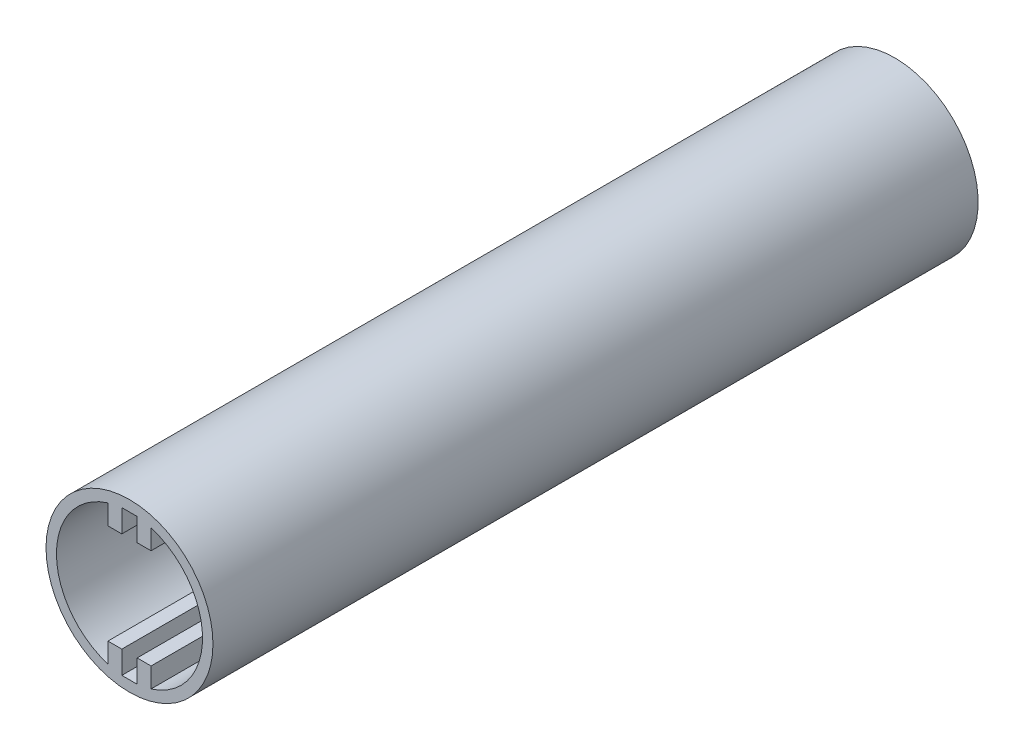
ISO-10303-21;
HEADER;
FILE_DESCRIPTION(('STEP AP214'),'2;1');
FILE_NAME('part.step','',(''),(''),'','','');
FILE_SCHEMA(('AUTOMOTIVE_DESIGN { 1 0 10303 214 1 1 1 1 }'));
ENDSEC;
DATA;
#1=APPLICATION_CONTEXT('core data for automotive mechanical design processes');
#2=APPLICATION_PROTOCOL_DEFINITION('international standard','automotive_design',2000,#1);
#3=PRODUCT_CONTEXT('',#1,'mechanical');
#4=PRODUCT('Part','Part','',(#3));
#5=PRODUCT_RELATED_PRODUCT_CATEGORY('part','',(#4));
#6=PRODUCT_DEFINITION_FORMATION('','',#4);
#7=PRODUCT_DEFINITION_CONTEXT('part definition',#1,'design');
#8=PRODUCT_DEFINITION('design','',#6,#7);
#9=PRODUCT_DEFINITION_SHAPE('','',#8);
#10=(LENGTH_UNIT() NAMED_UNIT(*) SI_UNIT(.MILLI.,.METRE.));
#11=(NAMED_UNIT(*) PLANE_ANGLE_UNIT() SI_UNIT($,.RADIAN.));
#12=(NAMED_UNIT(*) SI_UNIT($,.STERADIAN.) SOLID_ANGLE_UNIT());
#13=UNCERTAINTY_MEASURE_WITH_UNIT(LENGTH_MEASURE(1.E-05),#10,'distance_accuracy_value','');
#14=(GEOMETRIC_REPRESENTATION_CONTEXT(3) GLOBAL_UNCERTAINTY_ASSIGNED_CONTEXT((#13)) GLOBAL_UNIT_ASSIGNED_CONTEXT((#10,
#11,#12)) REPRESENTATION_CONTEXT('',''));
#15=CARTESIAN_POINT('',(0.,0.,0.));
#16=DIRECTION('',(0.,0.,1.));
#17=DIRECTION('',(1.,0.,0.));
#18=AXIS2_PLACEMENT_3D('',#15,#16,#17);
#19=CARTESIAN_POINT('',(0.,0.,-17.5));
#20=DIRECTION('',(0.,0.,1.));
#21=DIRECTION('',(1.,0.,0.));
#22=AXIS2_PLACEMENT_3D('',#19,#20,#21);
#23=PLANE('',#22);
#24=DIRECTION('',(0.,1.,0.));
#25=VECTOR('',#24,1.);
#26=CARTESIAN_POINT('',(-1.55,5.01597448159378,-17.5));
#27=LINE('',#26,#25);
#28=CARTESIAN_POINT('',(-1.55,3.58519596248818,-17.5));
#29=VERTEX_POINT('',#28);
#30=CARTESIAN_POINT('',(-1.55,5.01597448159378,-17.5));
#31=VERTEX_POINT('',#30);
#32=EDGE_CURVE('E168',#29,#31,#27,.T.);
#33=ORIENTED_EDGE('',*,*,#32,.T.);
#34=CARTESIAN_POINT('',(0.,0.,-17.5));
#35=DIRECTION('',(0.,0.,-1.));
#36=DIRECTION('',(-1.,0.,0.));
#37=AXIS2_PLACEMENT_3D('',#34,#35,#36);
#38=CIRCLE('',#37,5.25);
#39=CARTESIAN_POINT('',(-0.55,5.22111099288264,-17.5));
#40=VERTEX_POINT('',#39);
#41=EDGE_CURVE('E51',#31,#40,#38,.T.);
#42=ORIENTED_EDGE('',*,*,#41,.T.);
#43=DIRECTION('',(0.,-1.,0.));
#44=VECTOR('',#43,1.);
#45=CARTESIAN_POINT('',(-0.55,3.58519596248818,-17.5));
#46=LINE('',#45,#44);
#47=CARTESIAN_POINT('',(-0.55,3.58519596248818,-17.5));
#48=VERTEX_POINT('',#47);
#49=EDGE_CURVE('E212',#40,#48,#46,.T.);
#50=ORIENTED_EDGE('',*,*,#49,.T.);
#51=DIRECTION('',(-1.,0.,0.));
#52=VECTOR('',#51,1.);
#53=CARTESIAN_POINT('',(-1.55,3.58519596248818,-17.5));
#54=LINE('',#53,#52);
#55=EDGE_CURVE('E266',#48,#29,#54,.T.);
#56=ORIENTED_EDGE('',*,*,#55,.T.);
#57=EDGE_LOOP('',(#33,#42,#50,#56));
#58=FACE_BOUND('',#57,.T.);
#59=ADVANCED_FACE('F39',(#58),#23,.F.);
#60=DIRECTION('',(-1.,0.,0.));
#61=VECTOR('',#60,1.);
#62=CARTESIAN_POINT('',(-0.55,5.22111099288264,-17.5));
#63=LINE('',#62,#61);
#64=CARTESIAN_POINT('',(0.55,5.22111099288264,-17.5));
#65=VERTEX_POINT('',#64);
#66=EDGE_CURVE('E208',#65,#40,#63,.T.);
#67=ORIENTED_EDGE('',*,*,#66,.T.);
#68=EDGE_CURVE('E11',#40,#65,#38,.T.);
#69=ORIENTED_EDGE('',*,*,#68,.T.);
#70=EDGE_LOOP('',(#67,#69));
#71=FACE_BOUND('',#70,.T.);
#72=ADVANCED_FACE('F353',(#71),#23,.F.);
#73=DIRECTION('',(0.,1.,0.));
#74=VECTOR('',#73,1.);
#75=CARTESIAN_POINT('',(0.55,3.58519596248818,-17.5));
#76=LINE('',#75,#74);
#77=CARTESIAN_POINT('',(0.55,3.58519596248818,-17.5));
#78=VERTEX_POINT('',#77);
#79=EDGE_CURVE('E219',#78,#65,#76,.T.);
#80=ORIENTED_EDGE('',*,*,#79,.T.);
#81=CARTESIAN_POINT('',(1.55,5.01597448159378,-17.5));
#82=VERTEX_POINT('',#81);
#83=EDGE_CURVE('E49',#65,#82,#38,.T.);
#84=ORIENTED_EDGE('',*,*,#83,.T.);
#85=DIRECTION('',(0.,-1.,0.));
#86=VECTOR('',#85,1.);
#87=CARTESIAN_POINT('',(1.55,5.01597448159378,-17.5));
#88=LINE('',#87,#86);
#89=CARTESIAN_POINT('',(1.55,3.58519596248818,-17.5));
#90=VERTEX_POINT('',#89);
#91=EDGE_CURVE('E292',#82,#90,#88,.T.);
#92=ORIENTED_EDGE('',*,*,#91,.T.);
#93=DIRECTION('',(-1.,0.,0.));
#94=VECTOR('',#93,1.);
#95=CARTESIAN_POINT('',(1.55,3.58519596248818,-17.5));
#96=LINE('',#95,#94);
#97=EDGE_CURVE('E296',#90,#78,#96,.T.);
#98=ORIENTED_EDGE('',*,*,#97,.T.);
#99=EDGE_LOOP('',(#80,#84,#92,#98));
#100=FACE_BOUND('',#99,.T.);
#101=ADVANCED_FACE('F403',(#100),#23,.F.);
#102=DIRECTION('',(0.,-1.,0.));
#103=VECTOR('',#102,1.);
#104=CARTESIAN_POINT('',(1.55,-5.01597448159378,-17.5));
#105=LINE('',#104,#103);
#106=CARTESIAN_POINT('',(1.55,-3.58519596248818,-17.5));
#107=VERTEX_POINT('',#106);
#108=CARTESIAN_POINT('',(1.55,-5.01597448159378,-17.5));
#109=VERTEX_POINT('',#108);
#110=EDGE_CURVE('E288',#107,#109,#105,.T.);
#111=ORIENTED_EDGE('',*,*,#110,.T.);
#112=CARTESIAN_POINT('',(0.55,-5.22111099288264,-17.5));
#113=VERTEX_POINT('',#112);
#114=EDGE_CURVE('E190',#109,#113,#38,.T.);
#115=ORIENTED_EDGE('',*,*,#114,.T.);
#116=DIRECTION('',(0.,1.,0.));
#117=VECTOR('',#116,1.);
#118=CARTESIAN_POINT('',(0.55,-3.58519596248818,-17.5));
#119=LINE('',#118,#117);
#120=CARTESIAN_POINT('',(0.55,-3.58519596248818,-17.5));
#121=VERTEX_POINT('',#120);
#122=EDGE_CURVE('E280',#113,#121,#119,.T.);
#123=ORIENTED_EDGE('',*,*,#122,.T.);
#124=DIRECTION('',(1.,0.,0.));
#125=VECTOR('',#124,1.);
#126=CARTESIAN_POINT('',(1.55,-3.58519596248818,-17.5));
#127=LINE('',#126,#125);
#128=EDGE_CURVE('E284',#121,#107,#127,.T.);
#129=ORIENTED_EDGE('',*,*,#128,.T.);
#130=EDGE_LOOP('',(#111,#115,#123,#129));
#131=FACE_BOUND('',#130,.T.);
#132=ADVANCED_FACE('F362',(#131),#23,.F.);
#133=DIRECTION('',(1.,0.,0.));
#134=VECTOR('',#133,1.);
#135=CARTESIAN_POINT('',(-0.55,-5.22111099288264,-17.5));
#136=LINE('',#135,#134);
#137=CARTESIAN_POINT('',(-0.55,-5.22111099288264,-17.5));
#138=VERTEX_POINT('',#137);
#139=EDGE_CURVE('E276',#138,#113,#136,.T.);
#140=ORIENTED_EDGE('',*,*,#139,.T.);
#141=EDGE_CURVE('E187',#113,#138,#38,.T.);
#142=ORIENTED_EDGE('',*,*,#141,.T.);
#143=EDGE_LOOP('',(#140,#142));
#144=FACE_BOUND('',#143,.T.);
#145=ADVANCED_FACE('F378',(#144),#23,.F.);
#146=CARTESIAN_POINT('',(0.,0.,17.5));
#147=DIRECTION('',(0.,0.,1.));
#148=DIRECTION('',(1.,0.,0.));
#149=AXIS2_PLACEMENT_3D('',#146,#147,#148);
#150=PLANE('',#149);
#151=CARTESIAN_POINT('',(0.,0.,17.5));
#152=DIRECTION('',(0.,0.,1.));
#153=DIRECTION('',(1.,0.,0.));
#154=AXIS2_PLACEMENT_3D('',#151,#152,#153);
#155=CIRCLE('',#154,6.);
#156=CARTESIAN_POINT('',(6.,0.,17.5));
#157=VERTEX_POINT('',#156);
#158=EDGE_CURVE('E43',#157,#157,#155,.T.);
#159=ORIENTED_EDGE('',*,*,#158,.T.);
#160=EDGE_LOOP('',(#159));
#161=FACE_BOUND('',#160,.T.);
#162=DIRECTION('',(0.,-1.,0.));
#163=VECTOR('',#162,1.);
#164=CARTESIAN_POINT('',(-0.55,3.58519596248818,17.5));
#165=LINE('',#164,#163);
#166=CARTESIAN_POINT('',(-0.55,5.22111099288264,17.5));
#167=VERTEX_POINT('',#166);
#168=CARTESIAN_POINT('',(-0.55,3.58519596248818,17.5));
#169=VERTEX_POINT('',#168);
#170=EDGE_CURVE('E218',#167,#169,#165,.T.);
#171=ORIENTED_EDGE('',*,*,#170,.F.);
#172=DIRECTION('',(-1.,0.,0.));
#173=VECTOR('',#172,1.);
#174=CARTESIAN_POINT('',(-0.55,5.22111099288264,17.5));
#175=LINE('',#174,#173);
#176=CARTESIAN_POINT('',(0.55,5.22111099288264,17.5));
#177=VERTEX_POINT('',#176);
#178=EDGE_CURVE('E215',#177,#167,#175,.T.);
#179=ORIENTED_EDGE('',*,*,#178,.F.);
#180=DIRECTION('',(0.,1.,0.));
#181=VECTOR('',#180,1.);
#182=CARTESIAN_POINT('',(0.55,3.58519596248818,17.5));
#183=LINE('',#182,#181);
#184=CARTESIAN_POINT('',(0.55,3.58519596248818,17.5));
#185=VERTEX_POINT('',#184);
#186=EDGE_CURVE('E260',#185,#177,#183,.T.);
#187=ORIENTED_EDGE('',*,*,#186,.F.);
#188=DIRECTION('',(-1.,0.,0.));
#189=VECTOR('',#188,1.);
#190=CARTESIAN_POINT('',(1.55,3.58519596248818,17.5));
#191=LINE('',#190,#189);
#192=CARTESIAN_POINT('',(1.55,3.58519596248818,17.5));
#193=VERTEX_POINT('',#192);
#194=EDGE_CURVE('E257',#193,#185,#191,.T.);
#195=ORIENTED_EDGE('',*,*,#194,.F.);
#196=DIRECTION('',(0.,-1.,0.));
#197=VECTOR('',#196,1.);
#198=CARTESIAN_POINT('',(1.55,5.01597448159378,17.5));
#199=LINE('',#198,#197);
#200=CARTESIAN_POINT('',(1.55,5.01597448159378,17.5));
#201=VERTEX_POINT('',#200);
#202=EDGE_CURVE('E254',#201,#193,#199,.T.);
#203=ORIENTED_EDGE('',*,*,#202,.F.);
#204=CARTESIAN_POINT('',(0.,0.,17.5));
#205=DIRECTION('',(0.,0.,1.));
#206=DIRECTION('',(1.,0.,0.));
#207=AXIS2_PLACEMENT_3D('',#204,#205,#206);
#208=CIRCLE('',#207,5.25);
#209=CARTESIAN_POINT('',(1.55,-5.01597448159378,17.5));
#210=VERTEX_POINT('',#209);
#211=EDGE_CURVE('E251',#210,#201,#208,.T.);
#212=ORIENTED_EDGE('',*,*,#211,.F.);
#213=DIRECTION('',(0.,-1.,0.));
#214=VECTOR('',#213,1.);
#215=CARTESIAN_POINT('',(1.55,-5.01597448159378,17.5));
#216=LINE('',#215,#214);
#217=CARTESIAN_POINT('',(1.55,-3.58519596248818,17.5));
#218=VERTEX_POINT('',#217);
#219=EDGE_CURVE('E248',#218,#210,#216,.T.);
#220=ORIENTED_EDGE('',*,*,#219,.F.);
#221=DIRECTION('',(1.,0.,0.));
#222=VECTOR('',#221,1.);
#223=CARTESIAN_POINT('',(1.55,-3.58519596248818,17.5));
#224=LINE('',#223,#222);
#225=CARTESIAN_POINT('',(0.55,-3.58519596248818,17.5));
#226=VERTEX_POINT('',#225);
#227=EDGE_CURVE('E245',#226,#218,#224,.T.);
#228=ORIENTED_EDGE('',*,*,#227,.F.);
#229=DIRECTION('',(0.,1.,0.));
#230=VECTOR('',#229,1.);
#231=CARTESIAN_POINT('',(0.55,-3.58519596248818,17.5));
#232=LINE('',#231,#230);
#233=CARTESIAN_POINT('',(0.55,-5.22111099288264,17.5));
#234=VERTEX_POINT('',#233);
#235=EDGE_CURVE('E242',#234,#226,#232,.T.);
#236=ORIENTED_EDGE('',*,*,#235,.F.);
#237=DIRECTION('',(1.,0.,0.));
#238=VECTOR('',#237,1.);
#239=CARTESIAN_POINT('',(-0.55,-5.22111099288264,17.5));
#240=LINE('',#239,#238);
#241=CARTESIAN_POINT('',(-0.55,-5.22111099288264,17.5));
#242=VERTEX_POINT('',#241);
#243=EDGE_CURVE('E239',#242,#234,#240,.T.);
#244=ORIENTED_EDGE('',*,*,#243,.F.);
#245=DIRECTION('',(0.,-1.,0.));
#246=VECTOR('',#245,1.);
#247=CARTESIAN_POINT('',(-0.55,-3.58519596248818,17.5));
#248=LINE('',#247,#246);
#249=CARTESIAN_POINT('',(-0.55,-3.58519596248818,17.5));
#250=VERTEX_POINT('',#249);
#251=EDGE_CURVE('E236',#250,#242,#248,.T.);
#252=ORIENTED_EDGE('',*,*,#251,.F.);
#253=DIRECTION('',(1.,0.,0.));
#254=VECTOR('',#253,1.);
#255=CARTESIAN_POINT('',(-1.55,-3.58519596248818,17.5));
#256=LINE('',#255,#254);
#257=CARTESIAN_POINT('',(-1.55,-3.58519596248818,17.5));
#258=VERTEX_POINT('',#257);
#259=EDGE_CURVE('E233',#258,#250,#256,.T.);
#260=ORIENTED_EDGE('',*,*,#259,.F.);
#261=DIRECTION('',(0.,1.,0.));
#262=VECTOR('',#261,1.);
#263=CARTESIAN_POINT('',(-1.55,-5.01597448159378,17.5));
#264=LINE('',#263,#262);
#265=CARTESIAN_POINT('',(-1.55,-5.01597448159378,17.5));
#266=VERTEX_POINT('',#265);
#267=EDGE_CURVE('E230',#266,#258,#264,.T.);
#268=ORIENTED_EDGE('',*,*,#267,.F.);
#269=CARTESIAN_POINT('',(0.,0.,17.5));
#270=DIRECTION('',(0.,0.,1.));
#271=DIRECTION('',(1.,0.,0.));
#272=AXIS2_PLACEMENT_3D('',#269,#270,#271);
#273=CIRCLE('',#272,5.25);
#274=CARTESIAN_POINT('',(-1.55,5.01597448159378,17.5));
#275=VERTEX_POINT('',#274);
#276=EDGE_CURVE('E178',#275,#266,#273,.T.);
#277=ORIENTED_EDGE('',*,*,#276,.F.);
#278=DIRECTION('',(0.,1.,0.));
#279=VECTOR('',#278,1.);
#280=CARTESIAN_POINT('',(-1.55,5.01597448159378,17.5));
#281=LINE('',#280,#279);
#282=CARTESIAN_POINT('',(-1.55,3.58519596248818,17.5));
#283=VERTEX_POINT('',#282);
#284=EDGE_CURVE('E225',#283,#275,#281,.T.);
#285=ORIENTED_EDGE('',*,*,#284,.F.);
#286=DIRECTION('',(-1.,0.,0.));
#287=VECTOR('',#286,1.);
#288=CARTESIAN_POINT('',(-1.55,3.58519596248818,17.5));
#289=LINE('',#288,#287);
#290=EDGE_CURVE('E222',#169,#283,#289,.T.);
#291=ORIENTED_EDGE('',*,*,#290,.F.);
#292=EDGE_LOOP('',(#171,#179,#187,#195,#203,#212,#220,#228,#236,#244,#252,#260,#268,#277,#285,#291));
#293=FACE_BOUND('',#292,.T.);
#294=ADVANCED_FACE('F384',(#161,#293),#150,.T.);
#295=DIRECTION('',(0.,-1.,0.));
#296=VECTOR('',#295,1.);
#297=CARTESIAN_POINT('',(-0.55,-3.58519596248818,-17.5));
#298=LINE('',#297,#296);
#299=CARTESIAN_POINT('',(-0.55,-3.58519596248818,-17.5));
#300=VERTEX_POINT('',#299);
#301=EDGE_CURVE('E185',#300,#138,#298,.T.);
#302=ORIENTED_EDGE('',*,*,#301,.T.);
#303=CARTESIAN_POINT('',(-1.55,-5.01597448159378,-17.5));
#304=VERTEX_POINT('',#303);
#305=EDGE_CURVE('E175',#138,#304,#38,.T.);
#306=ORIENTED_EDGE('',*,*,#305,.T.);
#307=DIRECTION('',(0.,1.,0.));
#308=VECTOR('',#307,1.);
#309=CARTESIAN_POINT('',(-1.55,-5.01597448159378,-17.5));
#310=LINE('',#309,#308);
#311=CARTESIAN_POINT('',(-1.55,-3.58519596248818,-17.5));
#312=VERTEX_POINT('',#311);
#313=EDGE_CURVE('E155',#304,#312,#310,.T.);
#314=ORIENTED_EDGE('',*,*,#313,.T.);
#315=DIRECTION('',(1.,0.,0.));
#316=VECTOR('',#315,1.);
#317=CARTESIAN_POINT('',(-1.55,-3.58519596248818,-17.5));
#318=LINE('',#317,#316);
#319=EDGE_CURVE('E167',#312,#300,#318,.T.);
#320=ORIENTED_EDGE('',*,*,#319,.T.);
#321=EDGE_LOOP('',(#302,#306,#314,#320));
#322=FACE_BOUND('',#321,.T.);
#323=ADVANCED_FACE('F183',(#322),#23,.F.);
#324=CARTESIAN_POINT('',(0.,0.,17.5));
#325=DIRECTION('',(0.,0.,-1.));
#326=DIRECTION('',(-1.,0.,0.));
#327=AXIS2_PLACEMENT_3D('',#324,#325,#326);
#328=CYLINDRICAL_SURFACE('',#327,6.);
#329=ORIENTED_EDGE('',*,*,#158,.F.);
#330=EDGE_LOOP('',(#329));
#331=FACE_BOUND('',#330,.T.);
#332=CARTESIAN_POINT('',(0.,0.,-37.5));
#333=DIRECTION('',(0.,0.,-1.));
#334=DIRECTION('',(-1.,0.,0.));
#335=AXIS2_PLACEMENT_3D('',#332,#333,#334);
#336=CIRCLE('',#335,6.);
#337=CARTESIAN_POINT('',(-6.,0.,-37.5));
#338=VERTEX_POINT('',#337);
#339=EDGE_CURVE('E204',#338,#338,#336,.T.);
#340=ORIENTED_EDGE('',*,*,#339,.F.);
#341=EDGE_LOOP('',(#340));
#342=FACE_BOUND('',#341,.T.);
#343=ADVANCED_FACE('F41',(#331,#342),#328,.T.);
#344=CARTESIAN_POINT('',(-0.55,5.22111099288264,17.5));
#345=DIRECTION('',(0.,-1.,0.));
#346=DIRECTION('',(0.,0.,-1.));
#347=AXIS2_PLACEMENT_3D('',#344,#345,#346);
#348=PLANE('',#347);
#349=ORIENTED_EDGE('',*,*,#66,.F.);
#350=DIRECTION('',(0.,0.,-1.));
#351=VECTOR('',#350,1.);
#352=CARTESIAN_POINT('',(0.55,5.22111099288264,17.5));
#353=LINE('',#352,#351);
#354=EDGE_CURVE('E262',#177,#65,#353,.T.);
#355=ORIENTED_EDGE('',*,*,#354,.F.);
#356=ORIENTED_EDGE('',*,*,#178,.T.);
#357=DIRECTION('',(0.,0.,-1.));
#358=VECTOR('',#357,1.);
#359=CARTESIAN_POINT('',(-0.55,5.22111099288264,17.5));
#360=LINE('',#359,#358);
#361=EDGE_CURVE('E192',#167,#40,#360,.T.);
#362=ORIENTED_EDGE('',*,*,#361,.T.);
#363=EDGE_LOOP('',(#349,#355,#356,#362));
#364=FACE_BOUND('',#363,.T.);
#365=ADVANCED_FACE('F348',(#364),#348,.T.);
#366=CARTESIAN_POINT('',(-0.55,3.58519596248818,17.5));
#367=DIRECTION('',(1.,0.,0.));
#368=DIRECTION('',(0.,0.,-1.));
#369=AXIS2_PLACEMENT_3D('',#366,#367,#368);
#370=PLANE('',#369);
#371=ORIENTED_EDGE('',*,*,#49,.F.);
#372=ORIENTED_EDGE('',*,*,#361,.F.);
#373=ORIENTED_EDGE('',*,*,#170,.T.);
#374=DIRECTION('',(0.,0.,-1.));
#375=VECTOR('',#374,1.);
#376=CARTESIAN_POINT('',(-0.55,3.58519596248818,17.5));
#377=LINE('',#376,#375);
#378=EDGE_CURVE('E342',#169,#48,#377,.T.);
#379=ORIENTED_EDGE('',*,*,#378,.T.);
#380=EDGE_LOOP('',(#371,#372,#373,#379));
#381=FACE_BOUND('',#380,.T.);
#382=ADVANCED_FACE('F441',(#381),#370,.T.);
#383=CARTESIAN_POINT('',(-1.55,3.58519596248818,17.5));
#384=DIRECTION('',(0.,-1.,0.));
#385=DIRECTION('',(0.,0.,-1.));
#386=AXIS2_PLACEMENT_3D('',#383,#384,#385);
#387=PLANE('',#386);
#388=ORIENTED_EDGE('',*,*,#55,.F.);
#389=ORIENTED_EDGE('',*,*,#378,.F.);
#390=ORIENTED_EDGE('',*,*,#290,.T.);
#391=DIRECTION('',(0.,0.,-1.));
#392=VECTOR('',#391,1.);
#393=CARTESIAN_POINT('',(-1.55,3.58519596248818,17.5));
#394=LINE('',#393,#392);
#395=EDGE_CURVE('E339',#283,#29,#394,.T.);
#396=ORIENTED_EDGE('',*,*,#395,.T.);
#397=EDGE_LOOP('',(#388,#389,#390,#396));
#398=FACE_BOUND('',#397,.T.);
#399=ADVANCED_FACE('F435',(#398),#387,.T.);
#400=CARTESIAN_POINT('',(-1.55,5.01597448159378,17.5));
#401=DIRECTION('',(-1.,0.,0.));
#402=DIRECTION('',(0.,0.,1.));
#403=AXIS2_PLACEMENT_3D('',#400,#401,#402);
#404=PLANE('',#403);
#405=ORIENTED_EDGE('',*,*,#32,.F.);
#406=ORIENTED_EDGE('',*,*,#395,.F.);
#407=ORIENTED_EDGE('',*,*,#284,.T.);
#408=DIRECTION('',(0.,0.,-1.));
#409=VECTOR('',#408,1.);
#410=CARTESIAN_POINT('',(-1.55,5.01597448159378,17.5));
#411=LINE('',#410,#409);
#412=EDGE_CURVE('E180',#275,#31,#411,.T.);
#413=ORIENTED_EDGE('',*,*,#412,.T.);
#414=EDGE_LOOP('',(#405,#406,#407,#413));
#415=FACE_BOUND('',#414,.T.);
#416=ADVANCED_FACE('F440',(#415),#404,.T.);
#417=CARTESIAN_POINT('',(0.,0.,17.5));
#418=DIRECTION('',(0.,0.,-1.));
#419=DIRECTION('',(-1.,0.,0.));
#420=AXIS2_PLACEMENT_3D('',#417,#418,#419);
#421=CYLINDRICAL_SURFACE('',#420,5.25);
#422=DIRECTION('',(0.,0.,-1.));
#423=VECTOR('',#422,1.);
#424=CARTESIAN_POINT('',(-1.55,-5.01597448159378,17.5));
#425=LINE('',#424,#423);
#426=EDGE_CURVE('E158',#266,#304,#425,.T.);
#427=ORIENTED_EDGE('',*,*,#426,.T.);
#428=ORIENTED_EDGE('',*,*,#305,.F.);
#429=ORIENTED_EDGE('',*,*,#141,.F.);
#430=ORIENTED_EDGE('',*,*,#114,.F.);
#431=DIRECTION('',(0.,0.,-1.));
#432=VECTOR('',#431,1.);
#433=CARTESIAN_POINT('',(1.55,-5.01597448159378,17.5));
#434=LINE('',#433,#432);
#435=EDGE_CURVE('E315',#210,#109,#434,.T.);
#436=ORIENTED_EDGE('',*,*,#435,.F.);
#437=ORIENTED_EDGE('',*,*,#211,.T.);
#438=DIRECTION('',(0.,0.,-1.));
#439=VECTOR('',#438,1.);
#440=CARTESIAN_POINT('',(1.55,5.01597448159378,17.5));
#441=LINE('',#440,#439);
#442=EDGE_CURVE('E311',#201,#82,#441,.T.);
#443=ORIENTED_EDGE('',*,*,#442,.T.);
#444=ORIENTED_EDGE('',*,*,#83,.F.);
#445=ORIENTED_EDGE('',*,*,#68,.F.);
#446=ORIENTED_EDGE('',*,*,#41,.F.);
#447=ORIENTED_EDGE('',*,*,#412,.F.);
#448=ORIENTED_EDGE('',*,*,#276,.T.);
#449=EDGE_LOOP('',(#427,#428,#429,#430,#436,#437,#443,#444,#445,#446,#447,#448));
#450=FACE_BOUND('',#449,.T.);
#451=CARTESIAN_POINT('',(0.,0.,-37.5));
#452=DIRECTION('',(0.,0.,-1.));
#453=DIRECTION('',(-1.,0.,0.));
#454=AXIS2_PLACEMENT_3D('',#451,#452,#453);
#455=CIRCLE('',#454,5.25);
#456=CARTESIAN_POINT('',(-5.25,0.,-37.5));
#457=VERTEX_POINT('',#456);
#458=EDGE_CURVE('E196',#457,#457,#455,.T.);
#459=ORIENTED_EDGE('',*,*,#458,.T.);
#460=EDGE_LOOP('',(#459));
#461=FACE_BOUND('',#460,.T.);
#462=ADVANCED_FACE('F172',(#450,#461),#421,.F.);
#463=CARTESIAN_POINT('',(-1.55,-5.01597448159378,17.5));
#464=DIRECTION('',(-1.,0.,0.));
#465=DIRECTION('',(0.,0.,1.));
#466=AXIS2_PLACEMENT_3D('',#463,#464,#465);
#467=PLANE('',#466);
#468=ORIENTED_EDGE('',*,*,#313,.F.);
#469=ORIENTED_EDGE('',*,*,#426,.F.);
#470=ORIENTED_EDGE('',*,*,#267,.T.);
#471=DIRECTION('',(0.,0.,-1.));
#472=VECTOR('',#471,1.);
#473=CARTESIAN_POINT('',(-1.55,-3.58519596248818,17.5));
#474=LINE('',#473,#472);
#475=EDGE_CURVE('E161',#258,#312,#474,.T.);
#476=ORIENTED_EDGE('',*,*,#475,.T.);
#477=EDGE_LOOP('',(#468,#469,#470,#476));
#478=FACE_BOUND('',#477,.T.);
#479=ADVANCED_FACE('F157',(#478),#467,.T.);
#480=CARTESIAN_POINT('',(-1.55,-3.58519596248818,17.5));
#481=DIRECTION('',(0.,1.,0.));
#482=DIRECTION('',(0.,0.,1.));
#483=AXIS2_PLACEMENT_3D('',#480,#481,#482);
#484=PLANE('',#483);
#485=ORIENTED_EDGE('',*,*,#319,.F.);
#486=ORIENTED_EDGE('',*,*,#475,.F.);
#487=ORIENTED_EDGE('',*,*,#259,.T.);
#488=DIRECTION('',(0.,0.,-1.));
#489=VECTOR('',#488,1.);
#490=CARTESIAN_POINT('',(-0.55,-3.58519596248818,17.5));
#491=LINE('',#490,#489);
#492=EDGE_CURVE('E332',#250,#300,#491,.T.);
#493=ORIENTED_EDGE('',*,*,#492,.T.);
#494=EDGE_LOOP('',(#485,#486,#487,#493));
#495=FACE_BOUND('',#494,.T.);
#496=ADVANCED_FACE('F455',(#495),#484,.T.);
#497=CARTESIAN_POINT('',(-0.55,-3.58519596248818,17.5));
#498=DIRECTION('',(1.,0.,0.));
#499=DIRECTION('',(0.,0.,-1.));
#500=AXIS2_PLACEMENT_3D('',#497,#498,#499);
#501=PLANE('',#500);
#502=ORIENTED_EDGE('',*,*,#301,.F.);
#503=ORIENTED_EDGE('',*,*,#492,.F.);
#504=ORIENTED_EDGE('',*,*,#251,.T.);
#505=DIRECTION('',(0.,0.,-1.));
#506=VECTOR('',#505,1.);
#507=CARTESIAN_POINT('',(-0.55,-5.22111099288264,17.5));
#508=LINE('',#507,#506);
#509=EDGE_CURVE('E328',#242,#138,#508,.T.);
#510=ORIENTED_EDGE('',*,*,#509,.T.);
#511=EDGE_LOOP('',(#502,#503,#504,#510));
#512=FACE_BOUND('',#511,.T.);
#513=ADVANCED_FACE('F380',(#512),#501,.T.);
#514=CARTESIAN_POINT('',(-0.55,-5.22111099288264,17.5));
#515=DIRECTION('',(0.,1.,0.));
#516=DIRECTION('',(0.,0.,1.));
#517=AXIS2_PLACEMENT_3D('',#514,#515,#516);
#518=PLANE('',#517);
#519=ORIENTED_EDGE('',*,*,#139,.F.);
#520=ORIENTED_EDGE('',*,*,#509,.F.);
#521=ORIENTED_EDGE('',*,*,#243,.T.);
#522=DIRECTION('',(0.,0.,-1.));
#523=VECTOR('',#522,1.);
#524=CARTESIAN_POINT('',(0.55,-5.22111099288264,17.5));
#525=LINE('',#524,#523);
#526=EDGE_CURVE('E324',#234,#113,#525,.T.);
#527=ORIENTED_EDGE('',*,*,#526,.T.);
#528=EDGE_LOOP('',(#519,#520,#521,#527));
#529=FACE_BOUND('',#528,.T.);
#530=ADVANCED_FACE('F369',(#529),#518,.T.);
#531=CARTESIAN_POINT('',(0.55,-3.58519596248818,17.5));
#532=DIRECTION('',(-1.,0.,0.));
#533=DIRECTION('',(0.,0.,1.));
#534=AXIS2_PLACEMENT_3D('',#531,#532,#533);
#535=PLANE('',#534);
#536=ORIENTED_EDGE('',*,*,#122,.F.);
#537=ORIENTED_EDGE('',*,*,#526,.F.);
#538=ORIENTED_EDGE('',*,*,#235,.T.);
#539=DIRECTION('',(0.,0.,-1.));
#540=VECTOR('',#539,1.);
#541=CARTESIAN_POINT('',(0.55,-3.58519596248818,17.5));
#542=LINE('',#541,#540);
#543=EDGE_CURVE('E321',#226,#121,#542,.T.);
#544=ORIENTED_EDGE('',*,*,#543,.T.);
#545=EDGE_LOOP('',(#536,#537,#538,#544));
#546=FACE_BOUND('',#545,.T.);
#547=ADVANCED_FACE('F374',(#546),#535,.T.);
#548=CARTESIAN_POINT('',(1.55,-3.58519596248818,17.5));
#549=DIRECTION('',(0.,1.,0.));
#550=DIRECTION('',(0.,0.,1.));
#551=AXIS2_PLACEMENT_3D('',#548,#549,#550);
#552=PLANE('',#551);
#553=ORIENTED_EDGE('',*,*,#128,.F.);
#554=ORIENTED_EDGE('',*,*,#543,.F.);
#555=ORIENTED_EDGE('',*,*,#227,.T.);
#556=DIRECTION('',(0.,0.,-1.));
#557=VECTOR('',#556,1.);
#558=CARTESIAN_POINT('',(1.55,-3.58519596248818,17.5));
#559=LINE('',#558,#557);
#560=EDGE_CURVE('E318',#218,#107,#559,.T.);
#561=ORIENTED_EDGE('',*,*,#560,.T.);
#562=EDGE_LOOP('',(#553,#554,#555,#561));
#563=FACE_BOUND('',#562,.T.);
#564=ADVANCED_FACE('F389',(#563),#552,.T.);
#565=CARTESIAN_POINT('',(1.55,-5.01597448159378,17.5));
#566=DIRECTION('',(1.,0.,0.));
#567=DIRECTION('',(0.,0.,-1.));
#568=AXIS2_PLACEMENT_3D('',#565,#566,#567);
#569=PLANE('',#568);
#570=ORIENTED_EDGE('',*,*,#110,.F.);
#571=ORIENTED_EDGE('',*,*,#560,.F.);
#572=ORIENTED_EDGE('',*,*,#219,.T.);
#573=ORIENTED_EDGE('',*,*,#435,.T.);
#574=EDGE_LOOP('',(#570,#571,#572,#573));
#575=FACE_BOUND('',#574,.T.);
#576=ADVANCED_FACE('F392',(#575),#569,.T.);
#577=CARTESIAN_POINT('',(1.55,5.01597448159378,17.5));
#578=DIRECTION('',(1.,0.,0.));
#579=DIRECTION('',(0.,0.,-1.));
#580=AXIS2_PLACEMENT_3D('',#577,#578,#579);
#581=PLANE('',#580);
#582=ORIENTED_EDGE('',*,*,#91,.F.);
#583=ORIENTED_EDGE('',*,*,#442,.F.);
#584=ORIENTED_EDGE('',*,*,#202,.T.);
#585=DIRECTION('',(0.,0.,-1.));
#586=VECTOR('',#585,1.);
#587=CARTESIAN_POINT('',(1.55,3.58519596248818,17.5));
#588=LINE('',#587,#586);
#589=EDGE_CURVE('E308',#193,#90,#588,.T.);
#590=ORIENTED_EDGE('',*,*,#589,.T.);
#591=EDGE_LOOP('',(#582,#583,#584,#590));
#592=FACE_BOUND('',#591,.T.);
#593=ADVANCED_FACE('F399',(#592),#581,.T.);
#594=CARTESIAN_POINT('',(1.55,3.58519596248818,17.5));
#595=DIRECTION('',(0.,-1.,0.));
#596=DIRECTION('',(0.,0.,-1.));
#597=AXIS2_PLACEMENT_3D('',#594,#595,#596);
#598=PLANE('',#597);
#599=ORIENTED_EDGE('',*,*,#97,.F.);
#600=ORIENTED_EDGE('',*,*,#589,.F.);
#601=ORIENTED_EDGE('',*,*,#194,.T.);
#602=DIRECTION('',(0.,0.,-1.));
#603=VECTOR('',#602,1.);
#604=CARTESIAN_POINT('',(0.55,3.58519596248818,17.5));
#605=LINE('',#604,#603);
#606=EDGE_CURVE('E58',#185,#78,#605,.T.);
#607=ORIENTED_EDGE('',*,*,#606,.T.);
#608=EDGE_LOOP('',(#599,#600,#601,#607));
#609=FACE_BOUND('',#608,.T.);
#610=ADVANCED_FACE('F402',(#609),#598,.T.);
#611=CARTESIAN_POINT('',(0.55,3.58519596248818,17.5));
#612=DIRECTION('',(-1.,0.,0.));
#613=DIRECTION('',(0.,0.,1.));
#614=AXIS2_PLACEMENT_3D('',#611,#612,#613);
#615=PLANE('',#614);
#616=ORIENTED_EDGE('',*,*,#79,.F.);
#617=ORIENTED_EDGE('',*,*,#606,.F.);
#618=ORIENTED_EDGE('',*,*,#186,.T.);
#619=ORIENTED_EDGE('',*,*,#354,.T.);
#620=EDGE_LOOP('',(#616,#617,#618,#619));
#621=FACE_BOUND('',#620,.T.);
#622=ADVANCED_FACE('F488',(#621),#615,.T.);
#623=CARTESIAN_POINT('',(0.,0.,-37.5));
#624=DIRECTION('',(0.,0.,-1.));
#625=DIRECTION('',(-1.,0.,0.));
#626=AXIS2_PLACEMENT_3D('',#623,#624,#625);
#627=PLANE('',#626);
#628=ORIENTED_EDGE('',*,*,#339,.T.);
#629=EDGE_LOOP('',(#628));
#630=FACE_BOUND('',#629,.T.);
#631=ORIENTED_EDGE('',*,*,#458,.F.);
#632=EDGE_LOOP('',(#631));
#633=FACE_BOUND('',#632,.T.);
#634=ADVANCED_FACE('F521',(#630,#633),#627,.T.);
#635=CLOSED_SHELL('',(#59,#72,#101,#132,#145,#294,#323,#343,#365,#382,#399,#416,#462,#479,#496,
#513,#530,#547,#564,#576,#593,#610,#622,#634));
#636=MANIFOLD_SOLID_BREP('B2',#635);
#637=ADVANCED_BREP_SHAPE_REPRESENTATION('',(#18,#636),#14);
#638=SHAPE_DEFINITION_REPRESENTATION(#9,#637);
ENDSEC;
END-ISO-10303-21;
